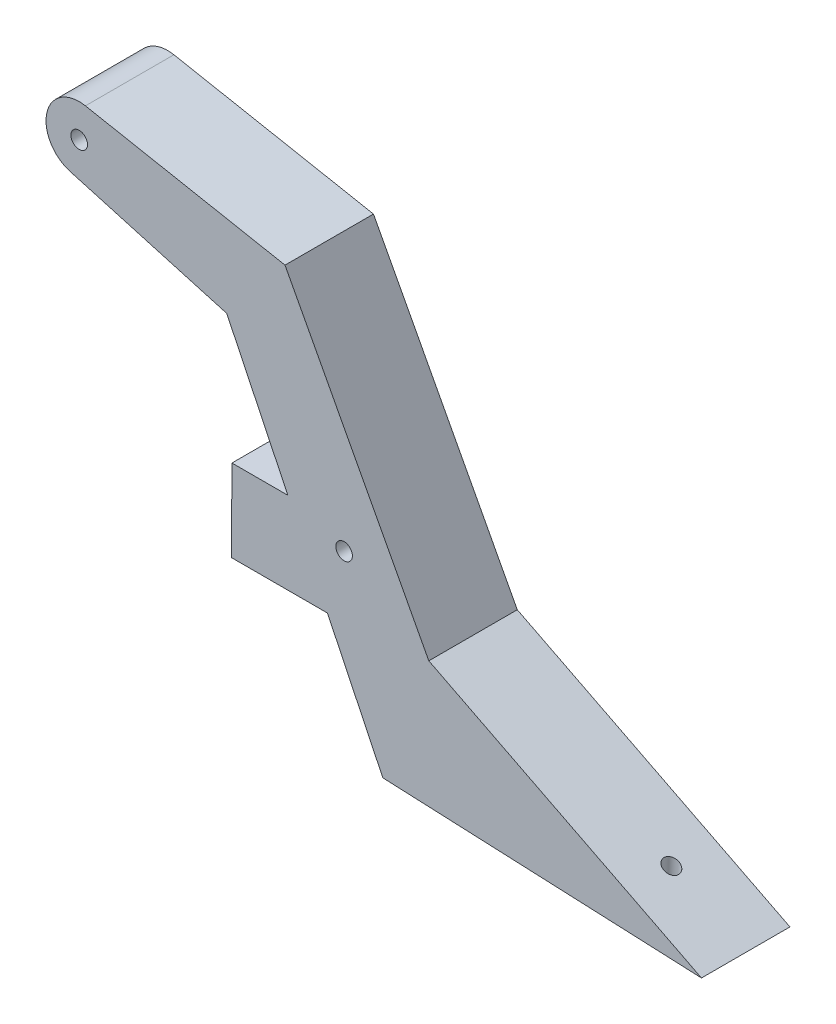
ISO-10303-21;
HEADER;
FILE_DESCRIPTION(('STEP AP214'),'2;1');
FILE_NAME('part.step','',(''),(''),'','','');
FILE_SCHEMA(('AUTOMOTIVE_DESIGN { 1 0 10303 214 1 1 1 1 }'));
ENDSEC;
DATA;
#1=APPLICATION_CONTEXT('core data for automotive mechanical design processes');
#2=APPLICATION_PROTOCOL_DEFINITION('international standard','automotive_design',2000,#1);
#3=PRODUCT_CONTEXT('',#1,'mechanical');
#4=PRODUCT('Part','Part','',(#3));
#5=PRODUCT_RELATED_PRODUCT_CATEGORY('part','',(#4));
#6=PRODUCT_DEFINITION_FORMATION('','',#4);
#7=PRODUCT_DEFINITION_CONTEXT('part definition',#1,'design');
#8=PRODUCT_DEFINITION('design','',#6,#7);
#9=PRODUCT_DEFINITION_SHAPE('','',#8);
#10=(LENGTH_UNIT() NAMED_UNIT(*) SI_UNIT(.MILLI.,.METRE.));
#11=(NAMED_UNIT(*) PLANE_ANGLE_UNIT() SI_UNIT($,.RADIAN.));
#12=(NAMED_UNIT(*) SI_UNIT($,.STERADIAN.) SOLID_ANGLE_UNIT());
#13=UNCERTAINTY_MEASURE_WITH_UNIT(LENGTH_MEASURE(1.E-05),#10,'distance_accuracy_value','');
#14=(GEOMETRIC_REPRESENTATION_CONTEXT(3) GLOBAL_UNCERTAINTY_ASSIGNED_CONTEXT((#13)) GLOBAL_UNIT_ASSIGNED_CONTEXT((#10,
#11,#12)) REPRESENTATION_CONTEXT('',''));
#15=CARTESIAN_POINT('',(0.,0.,0.));
#16=DIRECTION('',(0.,0.,1.));
#17=DIRECTION('',(1.,0.,0.));
#18=AXIS2_PLACEMENT_3D('',#15,#16,#17);
#19=CARTESIAN_POINT('',(26.6827335987823,-13.8357209188859,-17.));
#20=DIRECTION('',(0.900994795632333,0.433829895516032,0.));
#21=DIRECTION('',(-0.433829895516032,0.900994795632333,0.));
#22=AXIS2_PLACEMENT_3D('',#19,#20,#21);
#23=PLANE('',#22);
#24=DIRECTION('',(0.,0.,1.));
#25=VECTOR('',#24,1.);
#26=CARTESIAN_POINT('',(44.8954731018816,-51.6606464855785,0.));
#27=LINE('',#26,#25);
#28=CARTESIAN_POINT('',(44.8954731018816,-51.6606464855785,0.));
#29=VERTEX_POINT('',#28);
#30=CARTESIAN_POINT('',(44.8954731018816,-51.6606464855785,16.));
#31=VERTEX_POINT('',#30);
#32=EDGE_CURVE('E62',#29,#31,#27,.T.);
#33=ORIENTED_EDGE('',*,*,#32,.F.);
#34=DIRECTION('',(-0.433829895516032,0.900994795632333,0.));
#35=VECTOR('',#34,1.);
#36=CARTESIAN_POINT('',(16.2527340455594,7.82570770332413,0.));
#37=LINE('',#36,#35);
#38=CARTESIAN_POINT('',(54.9111175536976,-72.4615263218011,0.));
#39=VERTEX_POINT('',#38);
#40=EDGE_CURVE('E167',#39,#29,#37,.T.);
#41=ORIENTED_EDGE('',*,*,#40,.F.);
#42=DIRECTION('',(0.,0.,1.));
#43=VECTOR('',#42,1.);
#44=CARTESIAN_POINT('',(54.9111175536976,-72.4615263218011,-17.));
#45=LINE('',#44,#43);
#46=CARTESIAN_POINT('',(54.9111175536976,-72.4615263218011,16.));
#47=VERTEX_POINT('',#46);
#48=EDGE_CURVE('E165',#39,#47,#45,.T.);
#49=ORIENTED_EDGE('',*,*,#48,.T.);
#50=DIRECTION('',(-0.433829895516032,0.900994795632333,0.));
#51=VECTOR('',#50,1.);
#52=CARTESIAN_POINT('',(26.6827335987823,-13.8357209188859,16.));
#53=LINE('',#52,#51);
#54=EDGE_CURVE('E163',#47,#31,#53,.T.);
#55=ORIENTED_EDGE('',*,*,#54,.T.);
#56=EDGE_LOOP('',(#33,#41,#49,#55));
#57=FACE_BOUND('',#56,.T.);
#58=ADVANCED_FACE('F37',(#57),#23,.F.);
#59=CARTESIAN_POINT('',(0.,0.,16.));
#60=DIRECTION('',(0.,0.,1.));
#61=DIRECTION('',(1.,0.,0.));
#62=AXIS2_PLACEMENT_3D('',#59,#60,#61);
#63=PLANE('',#62);
#64=CARTESIAN_POINT('',(47.9111175536976,-40.4615263218011,16.));
#65=DIRECTION('',(0.,0.,1.));
#66=DIRECTION('',(1.,0.,0.));
#67=AXIS2_PLACEMENT_3D('',#64,#65,#66);
#68=CIRCLE('',#67,1.5);
#69=CARTESIAN_POINT('',(49.4111175536976,-40.4615263218011,16.));
#70=VERTEX_POINT('',#69);
#71=EDGE_CURVE('E152',#70,#70,#68,.T.);
#72=ORIENTED_EDGE('',*,*,#71,.F.);
#73=EDGE_LOOP('',(#72));
#74=FACE_BOUND('',#73,.T.);
#75=ORIENTED_EDGE('',*,*,#54,.F.);
#76=DIRECTION('',(0.999031203229182,-0.0440074422621161,0.));
#77=VECTOR('',#76,1.);
#78=CARTESIAN_POINT('',(112.538061605381,-75.,16.));
#79=LINE('',#78,#77);
#80=CARTESIAN_POINT('',(112.538061605381,-75.,16.));
#81=VERTEX_POINT('',#80);
#82=EDGE_CURVE('E192',#47,#81,#79,.T.);
#83=ORIENTED_EDGE('',*,*,#82,.T.);
#84=DIRECTION('',(-0.891770927429079,0.452487141245228,0.));
#85=VECTOR('',#84,1.);
#86=CARTESIAN_POINT('',(63.2279842048484,-49.979924472451,16.));
#87=LINE('',#86,#85);
#88=CARTESIAN_POINT('',(63.2279842048484,-49.979924472451,16.));
#89=VERTEX_POINT('',#88);
#90=EDGE_CURVE('E194',#81,#89,#87,.T.);
#91=ORIENTED_EDGE('',*,*,#90,.T.);
#92=DIRECTION('',(-0.469004414457743,0.883195821558928,0.));
#93=VECTOR('',#92,1.);
#94=CARTESIAN_POINT('',(37.2209746860255,-1.00537022475931,16.));
#95=LINE('',#94,#93);
#96=CARTESIAN_POINT('',(37.2209746860255,-1.00537022475931,16.));
#97=VERTEX_POINT('',#96);
#98=EDGE_CURVE('E197',#89,#97,#95,.T.);
#99=ORIENTED_EDGE('',*,*,#98,.T.);
#100=DIRECTION('',(-0.982220661889283,0.187730049160435,0.));
#101=VECTOR('',#100,1.);
#102=CARTESIAN_POINT('',(1.12638029496261,5.8933239713357,16.));
#103=LINE('',#102,#101);
#104=CARTESIAN_POINT('',(1.12638029496261,5.8933239713357,16.));
#105=VERTEX_POINT('',#104);
#106=EDGE_CURVE('E199',#97,#105,#103,.T.);
#107=ORIENTED_EDGE('',*,*,#106,.T.);
#108=CARTESIAN_POINT('',(0.,0.,16.));
#109=DIRECTION('',(0.,0.,1.));
#110=DIRECTION('',(1.,0.,0.));
#111=AXIS2_PLACEMENT_3D('',#108,#109,#110);
#112=CIRCLE('',#111,6.);
#113=CARTESIAN_POINT('',(-1.6430506475302,-5.77064853977875,16.));
#114=VERTEX_POINT('',#113);
#115=EDGE_CURVE('E201',#105,#114,#112,.T.);
#116=ORIENTED_EDGE('',*,*,#115,.T.);
#117=DIRECTION('',(0.961774756629791,-0.273841774588366,0.));
#118=VECTOR('',#117,1.);
#119=CARTESIAN_POINT('',(26.6827335987823,-13.8357209188859,16.));
#120=LINE('',#119,#118);
#121=CARTESIAN_POINT('',(26.6827335987823,-13.8357209188859,16.));
#122=VERTEX_POINT('',#121);
#123=EDGE_CURVE('E203',#114,#122,#120,.T.);
#124=ORIENTED_EDGE('',*,*,#123,.T.);
#125=CARTESIAN_POINT('',(37.7390571492395,-36.7979235719324,16.));
#126=VERTEX_POINT('',#125);
#127=EDGE_CURVE('E160',#126,#122,#53,.T.);
#128=ORIENTED_EDGE('',*,*,#127,.F.);
#129=DIRECTION('',(-1.,0.,0.));
#130=VECTOR('',#129,1.);
#131=CARTESIAN_POINT('',(0.,-36.7979235719324,16.));
#132=LINE('',#131,#130);
#133=CARTESIAN_POINT('',(27.6241323385364,-36.7979235719324,16.));
#134=VERTEX_POINT('',#133);
#135=EDGE_CURVE('E156',#126,#134,#132,.T.);
#136=ORIENTED_EDGE('',*,*,#135,.T.);
#137=DIRECTION('',(-0.00618972670800356,-0.999980843458154,0.));
#138=VECTOR('',#137,1.);
#139=CARTESIAN_POINT('',(27.8508387100436,-0.172392382645748,16.));
#140=LINE('',#139,#138);
#141=CARTESIAN_POINT('',(27.5321343832014,-51.6606464855785,16.));
#142=VERTEX_POINT('',#141);
#143=EDGE_CURVE('E128',#134,#142,#140,.T.);
#144=ORIENTED_EDGE('',*,*,#143,.T.);
#145=DIRECTION('',(-1.,0.,0.));
#146=VECTOR('',#145,1.);
#147=CARTESIAN_POINT('',(0.,-51.6606464855785,16.));
#148=LINE('',#147,#146);
#149=EDGE_CURVE('E147',#31,#142,#148,.T.);
#150=ORIENTED_EDGE('',*,*,#149,.F.);
#151=EDGE_LOOP('',(#75,#83,#91,#99,#107,#116,#124,#128,#136,#144,#150));
#152=FACE_BOUND('',#151,.T.);
#153=CARTESIAN_POINT('',(0.,0.,16.));
#154=DIRECTION('',(0.,0.,1.));
#155=DIRECTION('',(1.,0.,0.));
#156=AXIS2_PLACEMENT_3D('',#153,#154,#155);
#157=CIRCLE('',#156,1.5);
#158=CARTESIAN_POINT('',(1.5,0.,16.));
#159=VERTEX_POINT('',#158);
#160=EDGE_CURVE('E186',#159,#159,#157,.T.);
#161=ORIENTED_EDGE('',*,*,#160,.F.);
#162=EDGE_LOOP('',(#161));
#163=FACE_BOUND('',#162,.T.);
#164=ADVANCED_FACE('F254',(#74,#152,#163),#63,.T.);
#165=CARTESIAN_POINT('',(0.,0.,0.));
#166=DIRECTION('',(0.,0.,1.));
#167=DIRECTION('',(1.,0.,0.));
#168=AXIS2_PLACEMENT_3D('',#165,#166,#167);
#169=PLANE('',#168);
#170=CARTESIAN_POINT('',(47.9111175536976,-40.4615263218011,0.));
#171=DIRECTION('',(0.,0.,1.));
#172=DIRECTION('',(1.,0.,0.));
#173=AXIS2_PLACEMENT_3D('',#170,#171,#172);
#174=CIRCLE('',#173,1.5);
#175=CARTESIAN_POINT('',(49.4111175536976,-40.4615263218011,0.));
#176=VERTEX_POINT('',#175);
#177=EDGE_CURVE('E41',#176,#176,#174,.T.);
#178=ORIENTED_EDGE('',*,*,#177,.T.);
#179=EDGE_LOOP('',(#178));
#180=FACE_BOUND('',#179,.T.);
#181=DIRECTION('',(0.999031203229182,-0.0440074422621161,0.));
#182=VECTOR('',#181,1.);
#183=CARTESIAN_POINT('',(112.538061605381,-75.,0.));
#184=LINE('',#183,#182);
#185=CARTESIAN_POINT('',(112.538061605381,-75.,0.));
#186=VERTEX_POINT('',#185);
#187=EDGE_CURVE('E189',#39,#186,#184,.T.);
#188=ORIENTED_EDGE('',*,*,#187,.F.);
#189=ORIENTED_EDGE('',*,*,#40,.T.);
#190=DIRECTION('',(-1.,0.,0.));
#191=VECTOR('',#190,1.);
#192=CARTESIAN_POINT('',(0.,-51.6606464855785,0.));
#193=LINE('',#192,#191);
#194=CARTESIAN_POINT('',(27.5321343832014,-51.6606464855785,0.));
#195=VERTEX_POINT('',#194);
#196=EDGE_CURVE('E134',#29,#195,#193,.T.);
#197=ORIENTED_EDGE('',*,*,#196,.T.);
#198=DIRECTION('',(-0.00618972670800356,-0.999980843458154,0.));
#199=VECTOR('',#198,1.);
#200=CARTESIAN_POINT('',(27.8508387100436,-0.172392382645748,0.));
#201=LINE('',#200,#199);
#202=CARTESIAN_POINT('',(27.6241323385364,-36.7979235719324,0.));
#203=VERTEX_POINT('',#202);
#204=EDGE_CURVE('E126',#203,#195,#201,.T.);
#205=ORIENTED_EDGE('',*,*,#204,.F.);
#206=DIRECTION('',(-1.,0.,0.));
#207=VECTOR('',#206,1.);
#208=CARTESIAN_POINT('',(0.,-36.7979235719324,0.));
#209=LINE('',#208,#207);
#210=CARTESIAN_POINT('',(37.7390571492395,-36.7979235719324,0.));
#211=VERTEX_POINT('',#210);
#212=EDGE_CURVE('E141',#211,#203,#209,.T.);
#213=ORIENTED_EDGE('',*,*,#212,.F.);
#214=CARTESIAN_POINT('',(26.6827335987823,-13.8357209188859,0.));
#215=VERTEX_POINT('',#214);
#216=EDGE_CURVE('E54',#211,#215,#37,.T.);
#217=ORIENTED_EDGE('',*,*,#216,.T.);
#218=DIRECTION('',(0.961774756629791,-0.273841774588366,0.));
#219=VECTOR('',#218,1.);
#220=CARTESIAN_POINT('',(26.6827335987823,-13.8357209188859,0.));
#221=LINE('',#220,#219);
#222=CARTESIAN_POINT('',(-1.6430506475302,-5.77064853977875,0.));
#223=VERTEX_POINT('',#222);
#224=EDGE_CURVE('E195',#223,#215,#221,.T.);
#225=ORIENTED_EDGE('',*,*,#224,.F.);
#226=CARTESIAN_POINT('',(0.,0.,0.));
#227=DIRECTION('',(0.,0.,1.));
#228=DIRECTION('',(1.,0.,0.));
#229=AXIS2_PLACEMENT_3D('',#226,#227,#228);
#230=CIRCLE('',#229,6.);
#231=CARTESIAN_POINT('',(1.12638029496261,5.8933239713357,0.));
#232=VERTEX_POINT('',#231);
#233=EDGE_CURVE('E214',#232,#223,#230,.T.);
#234=ORIENTED_EDGE('',*,*,#233,.F.);
#235=DIRECTION('',(-0.982220661889283,0.187730049160435,0.));
#236=VECTOR('',#235,1.);
#237=CARTESIAN_POINT('',(1.12638029496261,5.8933239713357,0.));
#238=LINE('',#237,#236);
#239=CARTESIAN_POINT('',(37.2209746860255,-1.00537022475931,0.));
#240=VERTEX_POINT('',#239);
#241=EDGE_CURVE('E212',#240,#232,#238,.T.);
#242=ORIENTED_EDGE('',*,*,#241,.F.);
#243=DIRECTION('',(-0.469004414457743,0.883195821558928,0.));
#244=VECTOR('',#243,1.);
#245=CARTESIAN_POINT('',(37.2209746860255,-1.00537022475931,0.));
#246=LINE('',#245,#244);
#247=CARTESIAN_POINT('',(63.2279842048484,-49.979924472451,0.));
#248=VERTEX_POINT('',#247);
#249=EDGE_CURVE('E210',#248,#240,#246,.T.);
#250=ORIENTED_EDGE('',*,*,#249,.F.);
#251=DIRECTION('',(-0.891770927429079,0.452487141245228,0.));
#252=VECTOR('',#251,1.);
#253=CARTESIAN_POINT('',(63.2279842048484,-49.979924472451,0.));
#254=LINE('',#253,#252);
#255=EDGE_CURVE('E208',#186,#248,#254,.T.);
#256=ORIENTED_EDGE('',*,*,#255,.F.);
#257=EDGE_LOOP('',(#188,#189,#197,#205,#213,#217,#225,#234,#242,#250,#256));
#258=FACE_BOUND('',#257,.T.);
#259=CARTESIAN_POINT('',(0.,0.,0.));
#260=DIRECTION('',(0.,0.,1.));
#261=DIRECTION('',(1.,0.,0.));
#262=AXIS2_PLACEMENT_3D('',#259,#260,#261);
#263=CIRCLE('',#262,1.5);
#264=CARTESIAN_POINT('',(1.5,0.,0.));
#265=VERTEX_POINT('',#264);
#266=EDGE_CURVE('E182',#265,#265,#263,.T.);
#267=ORIENTED_EDGE('',*,*,#266,.T.);
#268=EDGE_LOOP('',(#267));
#269=FACE_BOUND('',#268,.T.);
#270=ADVANCED_FACE('F139',(#180,#258,#269),#169,.F.);
#271=CARTESIAN_POINT('',(112.538061605381,-75.,16.));
#272=DIRECTION('',(0.0440074422621161,0.999031203229182,0.));
#273=DIRECTION('',(-0.999031203229182,0.0440074422621161,0.));
#274=AXIS2_PLACEMENT_3D('',#271,#272,#273);
#275=PLANE('',#274);
#276=CARTESIAN_POINT('',(98.8217695266379,-74.3957957171363,8.));
#277=DIRECTION('',(-0.0440074422621161,-0.999031203229182,0.));
#278=DIRECTION('',(0.999031203229182,-0.0440074422621161,0.));
#279=AXIS2_PLACEMENT_3D('',#276,#277,#278);
#280=CIRCLE('',#279,1.35000000000001);
#281=CARTESIAN_POINT('',(100.170461650997,-74.4552057641901,8.));
#282=VERTEX_POINT('',#281);
#283=EDGE_CURVE('E170',#282,#282,#280,.T.);
#284=ORIENTED_EDGE('',*,*,#283,.F.);
#285=EDGE_LOOP('',(#284));
#286=FACE_BOUND('',#285,.T.);
#287=CARTESIAN_POINT('',(80.8392078685126,-73.6036617564182,8.));
#288=DIRECTION('',(-0.0440074422621161,-0.999031203229182,0.));
#289=DIRECTION('',(0.999031203229182,-0.0440074422621161,0.));
#290=AXIS2_PLACEMENT_3D('',#287,#288,#289);
#291=CIRCLE('',#290,1.35000000000001);
#292=CARTESIAN_POINT('',(82.1878999928721,-73.6630718034721,8.));
#293=VERTEX_POINT('',#292);
#294=EDGE_CURVE('E169',#293,#293,#291,.T.);
#295=ORIENTED_EDGE('',*,*,#294,.F.);
#296=EDGE_LOOP('',(#295));
#297=FACE_BOUND('',#296,.T.);
#298=CARTESIAN_POINT('',(62.8566462103874,-72.8115277957001,8.));
#299=DIRECTION('',(-0.0440074422621161,-0.999031203229182,0.));
#300=DIRECTION('',(0.999031203229182,-0.0440074422621161,0.));
#301=AXIS2_PLACEMENT_3D('',#298,#299,#300);
#302=CIRCLE('',#301,1.35000000000001);
#303=CARTESIAN_POINT('',(64.2053383347468,-72.870937842754,8.));
#304=VERTEX_POINT('',#303);
#305=EDGE_CURVE('E183',#304,#304,#302,.T.);
#306=ORIENTED_EDGE('',*,*,#305,.F.);
#307=EDGE_LOOP('',(#306));
#308=FACE_BOUND('',#307,.T.);
#309=ORIENTED_EDGE('',*,*,#82,.F.);
#310=ORIENTED_EDGE('',*,*,#48,.F.);
#311=ORIENTED_EDGE('',*,*,#187,.T.);
#312=DIRECTION('',(0.,0.,-1.));
#313=VECTOR('',#312,1.);
#314=CARTESIAN_POINT('',(112.538061605381,-75.,16.));
#315=LINE('',#314,#313);
#316=EDGE_CURVE('E11',#81,#186,#315,.T.);
#317=ORIENTED_EDGE('',*,*,#316,.F.);
#318=EDGE_LOOP('',(#309,#310,#311,#317));
#319=FACE_BOUND('',#318,.T.);
#320=ADVANCED_FACE('F39',(#286,#297,#308,#319),#275,.F.);
#321=CARTESIAN_POINT('',(63.2279842048484,-49.979924472451,16.));
#322=DIRECTION('',(-0.452487141245229,-0.89177092742908,0.));
#323=DIRECTION('',(0.891770927429079,-0.452487141245228,0.));
#324=AXIS2_PLACEMENT_3D('',#321,#322,#323);
#325=PLANE('',#324);
#326=CARTESIAN_POINT('',(99.0956086321407,-68.1792605812789,8.));
#327=DIRECTION('',(-0.452487141245229,-0.89177092742908,0.));
#328=DIRECTION('',(0.891770927429079,-0.452487141245228,0.));
#329=AXIS2_PLACEMENT_3D('',#326,#327,#328);
#330=ELLIPSE('',#329,1.48218124282779,1.35000000000001);
#331=CARTESIAN_POINT('',(100.417374773675,-68.8499285346534,8.));
#332=VERTEX_POINT('',#331);
#333=EDGE_CURVE('E173',#332,#332,#330,.T.);
#334=ORIENTED_EDGE('',*,*,#333,.T.);
#335=EDGE_LOOP('',(#334));
#336=FACE_BOUND('',#335,.T.);
#337=ORIENTED_EDGE('',*,*,#255,.T.);
#338=DIRECTION('',(0.,0.,-1.));
#339=VECTOR('',#338,1.);
#340=CARTESIAN_POINT('',(63.2279842048484,-49.979924472451,16.));
#341=LINE('',#340,#339);
#342=EDGE_CURVE('E46',#89,#248,#341,.T.);
#343=ORIENTED_EDGE('',*,*,#342,.F.);
#344=ORIENTED_EDGE('',*,*,#90,.F.);
#345=ORIENTED_EDGE('',*,*,#316,.T.);
#346=EDGE_LOOP('',(#337,#343,#344,#345));
#347=FACE_BOUND('',#346,.T.);
#348=ADVANCED_FACE('F232',(#336,#347),#325,.F.);
#349=CARTESIAN_POINT('',(37.2209746860255,-1.00537022475931,16.));
#350=DIRECTION('',(-0.883195821558928,-0.469004414457743,0.));
#351=DIRECTION('',(0.469004414457743,-0.883195821558928,0.));
#352=AXIS2_PLACEMENT_3D('',#349,#350,#351);
#353=PLANE('',#352);
#354=ORIENTED_EDGE('',*,*,#249,.T.);
#355=DIRECTION('',(0.,0.,-1.));
#356=VECTOR('',#355,1.);
#357=CARTESIAN_POINT('',(37.2209746860255,-1.00537022475931,16.));
#358=LINE('',#357,#356);
#359=EDGE_CURVE('E225',#97,#240,#358,.T.);
#360=ORIENTED_EDGE('',*,*,#359,.F.);
#361=ORIENTED_EDGE('',*,*,#98,.F.);
#362=ORIENTED_EDGE('',*,*,#342,.T.);
#363=EDGE_LOOP('',(#354,#360,#361,#362));
#364=FACE_BOUND('',#363,.T.);
#365=ADVANCED_FACE('F294',(#364),#353,.F.);
#366=CARTESIAN_POINT('',(1.12638029496261,5.8933239713357,16.));
#367=DIRECTION('',(-0.187730049160435,-0.982220661889283,0.));
#368=DIRECTION('',(0.982220661889283,-0.187730049160435,0.));
#369=AXIS2_PLACEMENT_3D('',#366,#367,#368);
#370=PLANE('',#369);
#371=ORIENTED_EDGE('',*,*,#241,.T.);
#372=DIRECTION('',(0.,0.,-1.));
#373=VECTOR('',#372,1.);
#374=CARTESIAN_POINT('',(1.12638029496261,5.8933239713357,16.));
#375=LINE('',#374,#373);
#376=EDGE_CURVE('E222',#105,#232,#375,.T.);
#377=ORIENTED_EDGE('',*,*,#376,.F.);
#378=ORIENTED_EDGE('',*,*,#106,.F.);
#379=ORIENTED_EDGE('',*,*,#359,.T.);
#380=EDGE_LOOP('',(#371,#377,#378,#379));
#381=FACE_BOUND('',#380,.T.);
#382=ADVANCED_FACE('F290',(#381),#370,.F.);
#383=CARTESIAN_POINT('',(0.,0.,16.));
#384=DIRECTION('',(0.,0.,-1.));
#385=DIRECTION('',(-1.,0.,0.));
#386=AXIS2_PLACEMENT_3D('',#383,#384,#385);
#387=CYLINDRICAL_SURFACE('',#386,6.);
#388=ORIENTED_EDGE('',*,*,#233,.T.);
#389=DIRECTION('',(0.,0.,-1.));
#390=VECTOR('',#389,1.);
#391=CARTESIAN_POINT('',(-1.6430506475302,-5.77064853977875,16.));
#392=LINE('',#391,#390);
#393=EDGE_CURVE('E219',#114,#223,#392,.T.);
#394=ORIENTED_EDGE('',*,*,#393,.F.);
#395=ORIENTED_EDGE('',*,*,#115,.F.);
#396=ORIENTED_EDGE('',*,*,#376,.T.);
#397=EDGE_LOOP('',(#388,#394,#395,#396));
#398=FACE_BOUND('',#397,.T.);
#399=ADVANCED_FACE('F286',(#398),#387,.T.);
#400=CARTESIAN_POINT('',(26.6827335987823,-13.8357209188859,16.));
#401=DIRECTION('',(0.273841774588366,0.961774756629791,0.));
#402=DIRECTION('',(-0.961774756629791,0.273841774588366,0.));
#403=AXIS2_PLACEMENT_3D('',#400,#401,#402);
#404=PLANE('',#403);
#405=ORIENTED_EDGE('',*,*,#224,.T.);
#406=DIRECTION('',(0.,0.,-1.));
#407=VECTOR('',#406,1.);
#408=CARTESIAN_POINT('',(26.6827335987823,-13.8357209188859,16.));
#409=LINE('',#408,#407);
#410=EDGE_CURVE('E206',#122,#215,#409,.T.);
#411=ORIENTED_EDGE('',*,*,#410,.F.);
#412=ORIENTED_EDGE('',*,*,#123,.F.);
#413=ORIENTED_EDGE('',*,*,#393,.T.);
#414=EDGE_LOOP('',(#405,#411,#412,#413));
#415=FACE_BOUND('',#414,.T.);
#416=ADVANCED_FACE('F279',(#415),#404,.F.);
#417=CARTESIAN_POINT('',(0.,0.,16.));
#418=DIRECTION('',(0.,0.,-1.));
#419=DIRECTION('',(-1.,0.,0.));
#420=AXIS2_PLACEMENT_3D('',#417,#418,#419);
#421=CYLINDRICAL_SURFACE('',#420,1.5);
#422=ORIENTED_EDGE('',*,*,#160,.T.);
#423=EDGE_LOOP('',(#422));
#424=FACE_BOUND('',#423,.T.);
#425=ORIENTED_EDGE('',*,*,#266,.F.);
#426=EDGE_LOOP('',(#425));
#427=FACE_BOUND('',#426,.T.);
#428=ADVANCED_FACE('F276',(#424,#427),#421,.F.);
#429=CARTESIAN_POINT('',(63.2967206330085,-62.8212157634083,8.));
#430=DIRECTION('',(-0.0440074422621161,-0.999031203229182,0.));
#431=DIRECTION('',(0.999031203229182,-0.0440074422621161,0.));
#432=AXIS2_PLACEMENT_3D('',#429,#430,#431);
#433=CYLINDRICAL_SURFACE('',#432,1.35000000000001);
#434=CARTESIAN_POINT('',(63.2967206330085,-62.8212157634083,8.));
#435=DIRECTION('',(-0.0440074422621161,-0.999031203229182,0.));
#436=DIRECTION('',(0.999031203229182,-0.0440074422621161,0.));
#437=AXIS2_PLACEMENT_3D('',#434,#435,#436);
#438=CIRCLE('',#437,1.35000000000001);
#439=CARTESIAN_POINT('',(64.6454127573679,-62.8806258104621,8.));
#440=VERTEX_POINT('',#439);
#441=EDGE_CURVE('E179',#440,#440,#438,.T.);
#442=ORIENTED_EDGE('',*,*,#441,.F.);
#443=EDGE_LOOP('',(#442));
#444=FACE_BOUND('',#443,.T.);
#445=ORIENTED_EDGE('',*,*,#305,.T.);
#446=EDGE_LOOP('',(#445));
#447=FACE_BOUND('',#446,.T.);
#448=ADVANCED_FACE('F248',(#444,#447),#433,.F.);
#449=CARTESIAN_POINT('',(63.2967206330085,-62.8212157634083,8.));
#450=DIRECTION('',(-0.0440074422621161,-0.999031203229182,0.));
#451=DIRECTION('',(0.999031203229182,-0.0440074422621161,0.));
#452=AXIS2_PLACEMENT_3D('',#449,#450,#451);
#453=PLANE('',#452);
#454=ORIENTED_EDGE('',*,*,#441,.T.);
#455=EDGE_LOOP('',(#454));
#456=FACE_BOUND('',#455,.T.);
#457=ADVANCED_FACE('F238',(#456),#453,.T.);
#458=CARTESIAN_POINT('',(99.2618439492591,-64.4054836848445,8.));
#459=DIRECTION('',(-0.0440074422621161,-0.999031203229182,0.));
#460=DIRECTION('',(0.999031203229182,-0.0440074422621161,0.));
#461=AXIS2_PLACEMENT_3D('',#458,#459,#460);
#462=CYLINDRICAL_SURFACE('',#461,1.35000000000001);
#463=ORIENTED_EDGE('',*,*,#283,.T.);
#464=EDGE_LOOP('',(#463));
#465=FACE_BOUND('',#464,.T.);
#466=ORIENTED_EDGE('',*,*,#333,.F.);
#467=EDGE_LOOP('',(#466));
#468=FACE_BOUND('',#467,.T.);
#469=ADVANCED_FACE('F235',(#465,#468),#462,.F.);
#470=CARTESIAN_POINT('',(81.2792822911338,-63.6133497241264,8.));
#471=DIRECTION('',(-0.0440074422621161,-0.999031203229182,0.));
#472=DIRECTION('',(0.999031203229182,-0.0440074422621161,0.));
#473=AXIS2_PLACEMENT_3D('',#470,#471,#472);
#474=CYLINDRICAL_SURFACE('',#473,1.35000000000001);
#475=CARTESIAN_POINT('',(81.2792822911338,-63.6133497241264,8.));
#476=DIRECTION('',(-0.0440074422621161,-0.999031203229182,0.));
#477=DIRECTION('',(0.999031203229182,-0.0440074422621161,0.));
#478=AXIS2_PLACEMENT_3D('',#475,#476,#477);
#479=CIRCLE('',#478,1.35000000000001);
#480=CARTESIAN_POINT('',(82.6279744154932,-63.6727597711802,8.));
#481=VERTEX_POINT('',#480);
#482=EDGE_CURVE('E174',#481,#481,#479,.T.);
#483=ORIENTED_EDGE('',*,*,#482,.F.);
#484=EDGE_LOOP('',(#483));
#485=FACE_BOUND('',#484,.T.);
#486=ORIENTED_EDGE('',*,*,#294,.T.);
#487=EDGE_LOOP('',(#486));
#488=FACE_BOUND('',#487,.T.);
#489=ADVANCED_FACE('F237',(#485,#488),#474,.F.);
#490=CARTESIAN_POINT('',(81.2792822911338,-63.6133497241264,8.));
#491=DIRECTION('',(-0.0440074422621161,-0.999031203229182,0.));
#492=DIRECTION('',(0.999031203229182,-0.0440074422621161,0.));
#493=AXIS2_PLACEMENT_3D('',#490,#491,#492);
#494=PLANE('',#493);
#495=ORIENTED_EDGE('',*,*,#482,.T.);
#496=EDGE_LOOP('',(#495));
#497=FACE_BOUND('',#496,.T.);
#498=ADVANCED_FACE('F245',(#497),#494,.T.);
#499=ORIENTED_EDGE('',*,*,#216,.F.);
#500=DIRECTION('',(0.,0.,1.));
#501=VECTOR('',#500,1.);
#502=CARTESIAN_POINT('',(37.7390571492395,-36.7979235719324,0.));
#503=LINE('',#502,#501);
#504=EDGE_CURVE('E146',#211,#126,#503,.T.);
#505=ORIENTED_EDGE('',*,*,#504,.T.);
#506=ORIENTED_EDGE('',*,*,#127,.T.);
#507=ORIENTED_EDGE('',*,*,#410,.T.);
#508=EDGE_LOOP('',(#499,#505,#506,#507));
#509=FACE_BOUND('',#508,.T.);
#510=ADVANCED_FACE('F255',(#509),#23,.F.);
#511=CARTESIAN_POINT('',(0.,-36.7979235719324,0.));
#512=DIRECTION('',(0.,1.,0.));
#513=DIRECTION('',(0.,0.,1.));
#514=AXIS2_PLACEMENT_3D('',#511,#512,#513);
#515=PLANE('',#514);
#516=ORIENTED_EDGE('',*,*,#135,.F.);
#517=ORIENTED_EDGE('',*,*,#504,.F.);
#518=ORIENTED_EDGE('',*,*,#212,.T.);
#519=DIRECTION('',(0.,0.,1.));
#520=VECTOR('',#519,1.);
#521=CARTESIAN_POINT('',(27.6241323385364,-36.7979235719324,0.));
#522=LINE('',#521,#520);
#523=EDGE_CURVE('E123',#203,#134,#522,.T.);
#524=ORIENTED_EDGE('',*,*,#523,.T.);
#525=EDGE_LOOP('',(#516,#517,#518,#524));
#526=FACE_BOUND('',#525,.T.);
#527=ADVANCED_FACE('F145',(#526),#515,.T.);
#528=CARTESIAN_POINT('',(0.,-51.6606464855785,0.));
#529=DIRECTION('',(0.,1.,0.));
#530=DIRECTION('',(0.,0.,1.));
#531=AXIS2_PLACEMENT_3D('',#528,#529,#530);
#532=PLANE('',#531);
#533=ORIENTED_EDGE('',*,*,#149,.T.);
#534=DIRECTION('',(0.,0.,1.));
#535=VECTOR('',#534,1.);
#536=CARTESIAN_POINT('',(27.5321343832014,-51.6606464855785,0.));
#537=LINE('',#536,#535);
#538=EDGE_CURVE('E133',#195,#142,#537,.T.);
#539=ORIENTED_EDGE('',*,*,#538,.F.);
#540=ORIENTED_EDGE('',*,*,#196,.F.);
#541=ORIENTED_EDGE('',*,*,#32,.T.);
#542=EDGE_LOOP('',(#533,#539,#540,#541));
#543=FACE_BOUND('',#542,.T.);
#544=ADVANCED_FACE('F268',(#543),#532,.F.);
#545=CARTESIAN_POINT('',(27.8508387100436,-0.172392382645748,0.));
#546=DIRECTION('',(-0.999980843458154,0.00618972670800356,0.));
#547=DIRECTION('',(-0.00618972670800356,-0.999980843458154,0.));
#548=AXIS2_PLACEMENT_3D('',#545,#546,#547);
#549=PLANE('',#548);
#550=CARTESIAN_POINT('',(27.5783919368642,-44.1875108028428,8.));
#551=DIRECTION('',(-0.999980843458154,0.00618972670800356,0.));
#552=DIRECTION('',(-0.00618972670800356,-0.999980843458154,0.));
#553=AXIS2_PLACEMENT_3D('',#550,#551,#552);
#554=CIRCLE('',#553,1.8);
#555=CARTESIAN_POINT('',(27.5672504287898,-45.9874763210675,8.));
#556=VERTEX_POINT('',#555);
#557=EDGE_CURVE('E358',#556,#556,#554,.T.);
#558=ORIENTED_EDGE('',*,*,#557,.F.);
#559=EDGE_LOOP('',(#558));
#560=FACE_BOUND('',#559,.T.);
#561=ORIENTED_EDGE('',*,*,#143,.F.);
#562=ORIENTED_EDGE('',*,*,#523,.F.);
#563=ORIENTED_EDGE('',*,*,#204,.T.);
#564=ORIENTED_EDGE('',*,*,#538,.T.);
#565=EDGE_LOOP('',(#561,#562,#563,#564));
#566=FACE_BOUND('',#565,.T.);
#567=ADVANCED_FACE('F125',(#560,#566),#549,.T.);
#568=CARTESIAN_POINT('',(47.9111175536976,-40.4615263218011,-8.));
#569=DIRECTION('',(0.,0.,1.));
#570=DIRECTION('',(1.,0.,0.));
#571=AXIS2_PLACEMENT_3D('',#568,#569,#570);
#572=CYLINDRICAL_SURFACE('',#571,1.5);
#573=CARTESIAN_POINT('',(49.4111175536976,-40.4615263218011,16.));
#574=CARTESIAN_POINT('',(49.4111175536976,-40.4615263218011,15.8333333333333));
#575=CARTESIAN_POINT('',(49.4111175536976,-40.4615263218011,15.6666666666667));
#576=CARTESIAN_POINT('',(49.4111175536976,-40.4615263218011,15.3333333333333));
#577=CARTESIAN_POINT('',(49.4111175536976,-40.4615263218011,15.1666666666667));
#578=CARTESIAN_POINT('',(49.4111175536976,-40.4615263218011,14.8333333333333));
#579=CARTESIAN_POINT('',(49.4111175536976,-40.4615263218011,14.6666666666667));
#580=CARTESIAN_POINT('',(49.4111175536976,-40.4615263218011,14.3333333333333));
#581=CARTESIAN_POINT('',(49.4111175536976,-40.4615263218011,14.1666666666667));
#582=CARTESIAN_POINT('',(49.4111175536976,-40.4615263218011,13.8333333333333));
#583=CARTESIAN_POINT('',(49.4111175536976,-40.4615263218011,13.6666666666667));
#584=CARTESIAN_POINT('',(49.4111175536976,-40.4615263218011,13.3333333333333));
#585=CARTESIAN_POINT('',(49.4111175536976,-40.4615263218011,13.1666666666667));
#586=CARTESIAN_POINT('',(49.4111175536976,-40.4615263218011,12.8333333333333));
#587=CARTESIAN_POINT('',(49.4111175536976,-40.4615263218011,12.6666666666667));
#588=CARTESIAN_POINT('',(49.4111175536976,-40.4615263218011,12.3333333333333));
#589=CARTESIAN_POINT('',(49.4111175536976,-40.4615263218011,12.1666666666667));
#590=CARTESIAN_POINT('',(49.4111175536976,-40.4615263218011,11.8333333333333));
#591=CARTESIAN_POINT('',(49.4111175536976,-40.4615263218011,11.6666666666667));
#592=CARTESIAN_POINT('',(49.4111175536976,-40.4615263218011,11.3333333333333));
#593=CARTESIAN_POINT('',(49.4111175536976,-40.4615263218011,11.1666666666667));
#594=CARTESIAN_POINT('',(49.4111175536976,-40.4615263218011,10.8333333333333));
#595=CARTESIAN_POINT('',(49.4111175536976,-40.4615263218011,10.6666666666667));
#596=CARTESIAN_POINT('',(49.4111175536976,-40.4615263218011,10.3333333333333));
#597=CARTESIAN_POINT('',(49.4111175536976,-40.4615263218011,10.1666666666667));
#598=CARTESIAN_POINT('',(49.4111175536976,-40.4615263218011,9.83333333333333));
#599=CARTESIAN_POINT('',(49.4111175536976,-40.4615263218011,9.66666666666667));
#600=CARTESIAN_POINT('',(49.4111175536976,-40.4615263218011,9.33333333333333));
#601=CARTESIAN_POINT('',(49.4111175536976,-40.4615263218011,9.16666666666666));
#602=CARTESIAN_POINT('',(49.4111175536976,-40.4615263218011,8.83333333333333));
#603=CARTESIAN_POINT('',(49.4111175536976,-40.4615263218011,8.66666666666667));
#604=CARTESIAN_POINT('',(49.4111175536976,-40.4615263218011,8.33333333333333));
#605=CARTESIAN_POINT('',(49.4111175536976,-40.4615263218011,8.16666666666667));
#606=CARTESIAN_POINT('',(49.4111175536976,-40.4615263218011,7.83333333333333));
#607=CARTESIAN_POINT('',(49.4111175536976,-40.4615263218011,7.66666666666667));
#608=CARTESIAN_POINT('',(49.4111175536976,-40.4615263218011,7.33333333333333));
#609=CARTESIAN_POINT('',(49.4111175536976,-40.4615263218011,7.16666666666667));
#610=CARTESIAN_POINT('',(49.4111175536976,-40.4615263218011,6.83333333333333));
#611=CARTESIAN_POINT('',(49.4111175536976,-40.4615263218011,6.66666666666667));
#612=CARTESIAN_POINT('',(49.4111175536976,-40.4615263218011,6.33333333333333));
#613=CARTESIAN_POINT('',(49.4111175536976,-40.4615263218011,6.16666666666667));
#614=CARTESIAN_POINT('',(49.4111175536976,-40.4615263218011,5.83333333333333));
#615=CARTESIAN_POINT('',(49.4111175536976,-40.4615263218011,5.66666666666667));
#616=CARTESIAN_POINT('',(49.4111175536976,-40.4615263218011,5.33333333333333));
#617=CARTESIAN_POINT('',(49.4111175536976,-40.4615263218011,5.16666666666667));
#618=CARTESIAN_POINT('',(49.4111175536976,-40.4615263218011,4.83333333333333));
#619=CARTESIAN_POINT('',(49.4111175536976,-40.4615263218011,4.66666666666667));
#620=CARTESIAN_POINT('',(49.4111175536976,-40.4615263218011,4.33333333333333));
#621=CARTESIAN_POINT('',(49.4111175536976,-40.4615263218011,4.16666666666667));
#622=CARTESIAN_POINT('',(49.4111175536976,-40.4615263218011,3.83333333333333));
#623=CARTESIAN_POINT('',(49.4111175536976,-40.4615263218011,3.66666666666667));
#624=CARTESIAN_POINT('',(49.4111175536976,-40.4615263218011,3.33333333333333));
#625=CARTESIAN_POINT('',(49.4111175536976,-40.4615263218011,3.16666666666667));
#626=CARTESIAN_POINT('',(49.4111175536976,-40.4615263218011,2.83333333333333));
#627=CARTESIAN_POINT('',(49.4111175536976,-40.4615263218011,2.66666666666667));
#628=CARTESIAN_POINT('',(49.4111175536976,-40.4615263218011,2.33333333333333));
#629=CARTESIAN_POINT('',(49.4111175536976,-40.4615263218011,2.16666666666667));
#630=CARTESIAN_POINT('',(49.4111175536976,-40.4615263218011,1.83333333333333));
#631=CARTESIAN_POINT('',(49.4111175536976,-40.4615263218011,1.66666666666666));
#632=CARTESIAN_POINT('',(49.4111175536976,-40.4615263218011,1.33333333333333));
#633=CARTESIAN_POINT('',(49.4111175536976,-40.4615263218011,1.16666666666667));
#634=CARTESIAN_POINT('',(49.4111175536976,-40.4615263218011,0.833333333333332));
#635=CARTESIAN_POINT('',(49.4111175536976,-40.4615263218011,0.666666666666666));
#636=CARTESIAN_POINT('',(49.4111175536976,-40.4615263218011,0.333333333333332));
#637=CARTESIAN_POINT('',(49.4111175536976,-40.4615263218011,0.166666666666665));
#638=CARTESIAN_POINT('',(49.4111175536976,-40.4615263218011,0.));
#639=B_SPLINE_CURVE_WITH_KNOTS('',3,(#573,#574,#575,#576,#577,#578,#579,#580,#581,#582,#583,
#584,#585,#586,#587,#588,#589,#590,#591,#592,#593,#594,#595,#596,#597,#598,#599,#600,#601,#602,
#603,#604,#605,#606,#607,#608,#609,#610,#611,#612,#613,#614,#615,#616,#617,#618,#619,#620,#621,
#622,#623,#624,#625,#626,#627,#628,#629,#630,#631,#632,#633,#634,#635,#636,#637,#638),
.UNSPECIFIED.,.F.,.F.,(4,2,2,2,2,2,2,2,2,2,2,2,2,2,2,2,2,2,2,2,2,2,2,2,2,2,2,2,2,2,2,2,4),(0.,
0.5,1.,1.5,2.,2.5,3.,3.5,4.,4.5,5.,5.5,6.,6.5,7.,7.5,8.,8.5,9.,9.5,10.,10.5,11.,11.5,12.,12.5,
13.,13.5,14.,14.5,15.,15.5,16.),.UNSPECIFIED.);
#640=EDGE_CURVE('BSEAM339',#70,#176,#639,.T.);
#641=ORIENTED_EDGE('',*,*,#71,.T.);
#642=ORIENTED_EDGE('',*,*,#177,.F.);
#643=ORIENTED_EDGE('',*,*,#640,.T.);
#644=ORIENTED_EDGE('',*,*,#640,.F.);
#645=EDGE_LOOP('',(#641,#643,#642,#644));
#646=FACE_BOUND('',#645,.T.);
#647=ADVANCED_FACE('F339',(#646),#572,.F.);
#648=CARTESIAN_POINT('',(37.5782003714457,-44.2494080699229,8.));
#649=DIRECTION('',(-0.999980843458154,0.00618972670800356,0.));
#650=DIRECTION('',(-0.00618972670800356,-0.999980843458154,0.));
#651=AXIS2_PLACEMENT_3D('',#648,#649,#650);
#652=CYLINDRICAL_SURFACE('',#651,1.8);
#653=CARTESIAN_POINT('',(37.5782003714457,-44.2494080699229,8.));
#654=DIRECTION('',(-0.999980843458154,0.00618972670800356,0.));
#655=DIRECTION('',(-0.00618972670800356,-0.999980843458154,0.));
#656=AXIS2_PLACEMENT_3D('',#653,#654,#655);
#657=CIRCLE('',#656,1.8);
#658=CARTESIAN_POINT('',(37.5670588633713,-46.0493735881475,8.));
#659=VERTEX_POINT('',#658);
#660=EDGE_CURVE('E357',#659,#659,#657,.T.);
#661=ORIENTED_EDGE('',*,*,#660,.F.);
#662=EDGE_LOOP('',(#661));
#663=FACE_BOUND('',#662,.T.);
#664=ORIENTED_EDGE('',*,*,#557,.T.);
#665=EDGE_LOOP('',(#664));
#666=FACE_BOUND('',#665,.T.);
#667=ADVANCED_FACE('F345',(#663,#666),#652,.F.);
#668=CARTESIAN_POINT('',(37.5782003714457,-44.2494080699229,8.));
#669=DIRECTION('',(-0.999980843458154,0.00618972670800356,0.));
#670=DIRECTION('',(-0.00618972670800356,-0.999980843458154,0.));
#671=AXIS2_PLACEMENT_3D('',#668,#669,#670);
#672=PLANE('',#671);
#673=ORIENTED_EDGE('',*,*,#660,.T.);
#674=EDGE_LOOP('',(#673));
#675=FACE_BOUND('',#674,.T.);
#676=ADVANCED_FACE('F349',(#675),#672,.T.);
#677=CLOSED_SHELL('',(#58,#164,#270,#320,#348,#365,#382,#399,#416,#428,#448,#457,#469,#489,#498,
#510,#527,#544,#567,#647,#667,#676));
#678=MANIFOLD_SOLID_BREP('B2',#677);
#679=ADVANCED_BREP_SHAPE_REPRESENTATION('',(#18,#678),#14);
#680=SHAPE_DEFINITION_REPRESENTATION(#9,#679);
ENDSEC;
END-ISO-10303-21;
